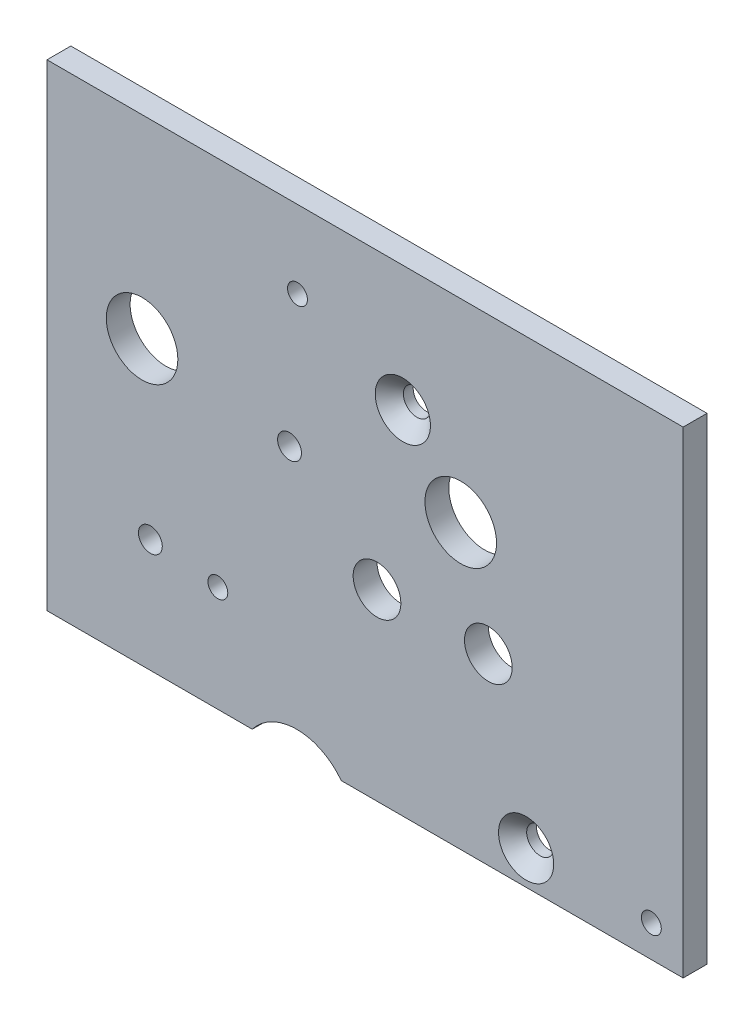
ISO-10303-21;
HEADER;
FILE_DESCRIPTION(('STEP AP214'),'2;1');
FILE_NAME('part.step','',(''),(''),'','','');
FILE_SCHEMA(('AUTOMOTIVE_DESIGN { 1 0 10303 214 1 1 1 1 }'));
ENDSEC;
DATA;
#1=APPLICATION_CONTEXT('core data for automotive mechanical design processes');
#2=APPLICATION_PROTOCOL_DEFINITION('international standard','automotive_design',2000,#1);
#3=PRODUCT_CONTEXT('',#1,'mechanical');
#4=PRODUCT('Part','Part','',(#3));
#5=PRODUCT_RELATED_PRODUCT_CATEGORY('part','',(#4));
#6=PRODUCT_DEFINITION_FORMATION('','',#4);
#7=PRODUCT_DEFINITION_CONTEXT('part definition',#1,'design');
#8=PRODUCT_DEFINITION('design','',#6,#7);
#9=PRODUCT_DEFINITION_SHAPE('','',#8);
#10=(LENGTH_UNIT() NAMED_UNIT(*) SI_UNIT(.MILLI.,.METRE.));
#11=(NAMED_UNIT(*) PLANE_ANGLE_UNIT() SI_UNIT($,.RADIAN.));
#12=(NAMED_UNIT(*) SI_UNIT($,.STERADIAN.) SOLID_ANGLE_UNIT());
#13=UNCERTAINTY_MEASURE_WITH_UNIT(LENGTH_MEASURE(1.E-05),#10,'distance_accuracy_value','');
#14=(GEOMETRIC_REPRESENTATION_CONTEXT(3) GLOBAL_UNCERTAINTY_ASSIGNED_CONTEXT((#13)) GLOBAL_UNIT_ASSIGNED_CONTEXT((#10,
#11,#12)) REPRESENTATION_CONTEXT('',''));
#15=CARTESIAN_POINT('',(0.,0.,0.));
#16=DIRECTION('',(0.,0.,1.));
#17=DIRECTION('',(1.,0.,0.));
#18=AXIS2_PLACEMENT_3D('',#15,#16,#17);
#19=CARTESIAN_POINT('',(-9.69554599829082,222.144430061647,56.1999999999973));
#20=DIRECTION('',(0.,0.,1.));
#21=DIRECTION('',(1.,0.,0.));
#22=AXIS2_PLACEMENT_3D('',#19,#20,#21);
#23=PLANE('',#22);
#24=CARTESIAN_POINT('',(-9.60659272785415,276.603254387935,56.1999999999973));
#25=DIRECTION('',(0.,0.,1.));
#26=DIRECTION('',(1.,0.,0.));
#27=AXIS2_PLACEMENT_3D('',#24,#25,#26);
#28=CIRCLE('',#27,1.25);
#29=CARTESIAN_POINT('',(-8.35659272785415,276.603254387935,56.1999999999973));
#30=VERTEX_POINT('',#29);
#31=EDGE_CURVE('E281',#30,#30,#28,.T.);
#32=ORIENTED_EDGE('',*,*,#31,.F.);
#33=EDGE_LOOP('',(#32));
#34=FACE_BOUND('',#33,.T.);
#35=CARTESIAN_POINT('',(-19.6207435856521,239.653254387935,56.1999999999973));
#36=DIRECTION('',(0.,0.,1.));
#37=DIRECTION('',(1.,0.,0.));
#38=AXIS2_PLACEMENT_3D('',#35,#36,#37);
#39=CIRCLE('',#38,1.25);
#40=CARTESIAN_POINT('',(-18.3707435856521,239.653254387935,56.1999999999973));
#41=VERTEX_POINT('',#40);
#42=EDGE_CURVE('E286',#41,#41,#39,.T.);
#43=ORIENTED_EDGE('',*,*,#42,.F.);
#44=EDGE_LOOP('',(#43));
#45=FACE_BOUND('',#44,.T.);
#46=CARTESIAN_POINT('',(34.8934072721459,230.353254387935,56.1999999999973));
#47=DIRECTION('',(0.,0.,1.));
#48=DIRECTION('',(1.,0.,0.));
#49=AXIS2_PLACEMENT_3D('',#46,#47,#48);
#50=CIRCLE('',#49,1.25);
#51=CARTESIAN_POINT('',(36.1434072721459,230.353254387935,56.1999999999973));
#52=VERTEX_POINT('',#51);
#53=EDGE_CURVE('E290',#52,#52,#50,.T.);
#54=ORIENTED_EDGE('',*,*,#53,.F.);
#55=EDGE_LOOP('',(#54));
#56=FACE_BOUND('',#55,.T.);
#57=CARTESIAN_POINT('',(-28.106592727854,240.603254387935,56.1999999999973));
#58=DIRECTION('',(0.,0.,1.));
#59=DIRECTION('',(1.,0.,0.));
#60=AXIS2_PLACEMENT_3D('',#57,#58,#59);
#61=CIRCLE('',#60,1.5);
#62=CARTESIAN_POINT('',(-26.606592727854,240.603254387935,56.1999999999973));
#63=VERTEX_POINT('',#62);
#64=EDGE_CURVE('E138',#63,#63,#61,.T.);
#65=ORIENTED_EDGE('',*,*,#64,.F.);
#66=EDGE_LOOP('',(#65));
#67=FACE_BOUND('',#66,.T.);
#68=CARTESIAN_POINT('',(-10.606592727854,259.503254387935,56.1999999999973));
#69=DIRECTION('',(0.,0.,1.));
#70=DIRECTION('',(1.,0.,0.));
#71=AXIS2_PLACEMENT_3D('',#68,#69,#70);
#72=CIRCLE('',#71,1.50000000000001);
#73=CARTESIAN_POINT('',(-9.10659272785396,259.503254387935,56.1999999999973));
#74=VERTEX_POINT('',#73);
#75=EDGE_CURVE('E144',#74,#74,#72,.T.);
#76=ORIENTED_EDGE('',*,*,#75,.F.);
#77=EDGE_LOOP('',(#76));
#78=FACE_BOUND('',#77,.T.);
#79=CARTESIAN_POINT('',(3.64340727214603,270.603254387935,56.1999999999973));
#80=DIRECTION('',(0.,0.,1.));
#81=DIRECTION('',(1.,0.,0.));
#82=AXIS2_PLACEMENT_3D('',#79,#80,#81);
#83=CIRCLE('',#82,3.47);
#84=CARTESIAN_POINT('',(7.11340727214603,270.603254387935,56.1999999999973));
#85=VERTEX_POINT('',#84);
#86=EDGE_CURVE('E142',#85,#85,#83,.T.);
#87=ORIENTED_EDGE('',*,*,#86,.F.);
#88=EDGE_LOOP('',(#87));
#89=FACE_BOUND('',#88,.T.);
#90=CARTESIAN_POINT('',(19.143407272146,230.603254387935,56.1999999999973));
#91=DIRECTION('',(0.,0.,1.));
#92=DIRECTION('',(1.,0.,0.));
#93=AXIS2_PLACEMENT_3D('',#90,#91,#92);
#94=CIRCLE('',#93,3.47);
#95=CARTESIAN_POINT('',(22.613407272146,230.603254387935,56.1999999999973));
#96=VERTEX_POINT('',#95);
#97=EDGE_CURVE('E163',#96,#96,#94,.T.);
#98=ORIENTED_EDGE('',*,*,#97,.F.);
#99=EDGE_LOOP('',(#98));
#100=FACE_BOUND('',#99,.T.);
#101=CARTESIAN_POINT('',(-29.1504737784015,261.956143729674,56.1999999999973));
#102=DIRECTION('',(0.,0.,1.));
#103=DIRECTION('',(1.,0.,0.));
#104=AXIS2_PLACEMENT_3D('',#101,#102,#103);
#105=CIRCLE('',#104,4.50000000000001);
#106=CARTESIAN_POINT('',(-24.6504737784015,261.956143729674,56.1999999999973));
#107=VERTEX_POINT('',#106);
#108=EDGE_CURVE('E179',#107,#107,#105,.T.);
#109=ORIENTED_EDGE('',*,*,#108,.F.);
#110=EDGE_LOOP('',(#109));
#111=FACE_BOUND('',#110,.T.);
#112=CARTESIAN_POINT('',(14.393407272146,249.403254387935,56.1999999999973));
#113=DIRECTION('',(0.,0.,1.));
#114=DIRECTION('',(1.,0.,0.));
#115=AXIS2_PLACEMENT_3D('',#112,#113,#114);
#116=CIRCLE('',#115,3.);
#117=CARTESIAN_POINT('',(17.393407272146,249.403254387935,56.1999999999973));
#118=VERTEX_POINT('',#117);
#119=EDGE_CURVE('E124',#118,#118,#116,.T.);
#120=ORIENTED_EDGE('',*,*,#119,.F.);
#121=EDGE_LOOP('',(#120));
#122=FACE_BOUND('',#121,.T.);
#123=DIRECTION('',(0.,-1.,0.));
#124=VECTOR('',#123,1.);
#125=CARTESIAN_POINT('',(-41.106592727854,226.353254387935,56.1999999999973));
#126=LINE('',#125,#124);
#127=CARTESIAN_POINT('',(-41.106592727854,286.353254387935,56.1999999999973));
#128=VERTEX_POINT('',#127);
#129=CARTESIAN_POINT('',(-41.106592727854,226.353254387935,56.1999999999973));
#130=VERTEX_POINT('',#129);
#131=EDGE_CURVE('E131',#128,#130,#126,.T.);
#132=ORIENTED_EDGE('',*,*,#131,.T.);
#133=DIRECTION('',(1.,0.,0.));
#134=VECTOR('',#133,1.);
#135=CARTESIAN_POINT('',(-41.106592727854,226.353254387935,56.1999999999973));
#136=LINE('',#135,#134);
#137=CARTESIAN_POINT('',(-15.2889115804118,226.353254387935,56.1999999999973));
#138=VERTEX_POINT('',#137);
#139=EDGE_CURVE('E89',#130,#138,#136,.T.);
#140=ORIENTED_EDGE('',*,*,#139,.T.);
#141=CARTESIAN_POINT('',(-9.69554599829082,222.144430061647,56.1999999999973));
#142=DIRECTION('',(0.,0.,-1.));
#143=DIRECTION('',(1.,0.,0.));
#144=AXIS2_PLACEMENT_3D('',#141,#142,#143);
#145=CIRCLE('',#144,6.99999576748517);
#146=CARTESIAN_POINT('',(-4.10218041616985,226.353254387935,56.1999999999973));
#147=VERTEX_POINT('',#146);
#148=EDGE_CURVE('E102',#138,#147,#145,.T.);
#149=ORIENTED_EDGE('',*,*,#148,.T.);
#150=DIRECTION('',(1.,0.,0.));
#151=VECTOR('',#150,1.);
#152=CARTESIAN_POINT('',(-4.10218041616985,226.353254387935,56.1999999999973));
#153=LINE('',#152,#151);
#154=CARTESIAN_POINT('',(38.893407272146,226.353254387935,56.1999999999973));
#155=VERTEX_POINT('',#154);
#156=EDGE_CURVE('E96',#147,#155,#153,.T.);
#157=ORIENTED_EDGE('',*,*,#156,.T.);
#158=DIRECTION('',(0.,1.,0.));
#159=VECTOR('',#158,1.);
#160=CARTESIAN_POINT('',(38.893407272146,226.353254387935,56.1999999999973));
#161=LINE('',#160,#159);
#162=CARTESIAN_POINT('',(38.893407272146,286.353254387935,56.1999999999973));
#163=VERTEX_POINT('',#162);
#164=EDGE_CURVE('E100',#155,#163,#161,.T.);
#165=ORIENTED_EDGE('',*,*,#164,.T.);
#166=DIRECTION('',(-1.,0.,0.));
#167=VECTOR('',#166,1.);
#168=CARTESIAN_POINT('',(-41.106592727854,286.353254387935,56.1999999999973));
#169=LINE('',#168,#167);
#170=EDGE_CURVE('E52',#163,#128,#169,.T.);
#171=ORIENTED_EDGE('',*,*,#170,.T.);
#172=EDGE_LOOP('',(#132,#140,#149,#157,#165,#171));
#173=FACE_BOUND('',#172,.T.);
#174=CARTESIAN_POINT('',(0.393407272146032,249.403254387935,56.1999999999973));
#175=DIRECTION('',(0.,0.,1.));
#176=DIRECTION('',(1.,0.,0.));
#177=AXIS2_PLACEMENT_3D('',#174,#175,#176);
#178=CIRCLE('',#177,3.);
#179=CARTESIAN_POINT('',(3.39340727214603,249.403254387935,56.1999999999973));
#180=VERTEX_POINT('',#179);
#181=EDGE_CURVE('E185',#180,#180,#178,.T.);
#182=ORIENTED_EDGE('',*,*,#181,.F.);
#183=EDGE_LOOP('',(#182));
#184=FACE_BOUND('',#183,.T.);
#185=CARTESIAN_POINT('',(10.9230632657301,261.985726174726,56.1999999999973));
#186=DIRECTION('',(0.,0.,1.));
#187=DIRECTION('',(1.,0.,0.));
#188=AXIS2_PLACEMENT_3D('',#185,#186,#187);
#189=CIRCLE('',#188,4.5);
#190=CARTESIAN_POINT('',(15.4230632657301,261.985726174726,56.1999999999973));
#191=VERTEX_POINT('',#190);
#192=EDGE_CURVE('E173',#191,#191,#189,.T.);
#193=ORIENTED_EDGE('',*,*,#192,.F.);
#194=EDGE_LOOP('',(#193));
#195=FACE_BOUND('',#194,.T.);
#196=ADVANCED_FACE('F33',(#34,#45,#56,#67,#78,#89,#100,#111,#122,#173,#184,#195),#23,.T.);
#197=CARTESIAN_POINT('',(-9.69554599829082,222.144430061647,53.1999999999973));
#198=DIRECTION('',(0.,0.,1.));
#199=DIRECTION('',(1.,0.,0.));
#200=AXIS2_PLACEMENT_3D('',#197,#198,#199);
#201=PLANE('',#200);
#202=CARTESIAN_POINT('',(-9.60659272785415,276.603254387935,53.1999999999973));
#203=DIRECTION('',(0.,0.,1.));
#204=DIRECTION('',(1.,0.,0.));
#205=AXIS2_PLACEMENT_3D('',#202,#203,#204);
#206=CIRCLE('',#205,1.25);
#207=CARTESIAN_POINT('',(-8.35659272785415,276.603254387935,53.1999999999973));
#208=VERTEX_POINT('',#207);
#209=EDGE_CURVE('E149',#208,#208,#206,.F.);
#210=ORIENTED_EDGE('',*,*,#209,.F.);
#211=EDGE_LOOP('',(#210));
#212=FACE_BOUND('',#211,.T.);
#213=CARTESIAN_POINT('',(-19.6207435856521,239.653254387935,53.1999999999973));
#214=DIRECTION('',(0.,0.,1.));
#215=DIRECTION('',(1.,0.,0.));
#216=AXIS2_PLACEMENT_3D('',#213,#214,#215);
#217=CIRCLE('',#216,1.25);
#218=CARTESIAN_POINT('',(-18.3707435856521,239.653254387935,53.1999999999973));
#219=VERTEX_POINT('',#218);
#220=EDGE_CURVE('E282',#219,#219,#217,.F.);
#221=ORIENTED_EDGE('',*,*,#220,.F.);
#222=EDGE_LOOP('',(#221));
#223=FACE_BOUND('',#222,.T.);
#224=CARTESIAN_POINT('',(34.8934072721459,230.353254387935,53.1999999999973));
#225=DIRECTION('',(0.,0.,1.));
#226=DIRECTION('',(1.,0.,0.));
#227=AXIS2_PLACEMENT_3D('',#224,#225,#226);
#228=CIRCLE('',#227,1.25);
#229=CARTESIAN_POINT('',(36.1434072721459,230.353254387935,53.1999999999973));
#230=VERTEX_POINT('',#229);
#231=EDGE_CURVE('E152',#230,#230,#228,.F.);
#232=ORIENTED_EDGE('',*,*,#231,.F.);
#233=EDGE_LOOP('',(#232));
#234=FACE_BOUND('',#233,.T.);
#235=CARTESIAN_POINT('',(-28.106592727854,240.603254387935,53.1999999999973));
#236=DIRECTION('',(0.,0.,1.));
#237=DIRECTION('',(1.,0.,0.));
#238=AXIS2_PLACEMENT_3D('',#235,#236,#237);
#239=CIRCLE('',#238,1.5);
#240=CARTESIAN_POINT('',(-26.606592727854,240.603254387935,53.1999999999973));
#241=VERTEX_POINT('',#240);
#242=EDGE_CURVE('E37',#241,#241,#239,.T.);
#243=ORIENTED_EDGE('',*,*,#242,.T.);
#244=EDGE_LOOP('',(#243));
#245=FACE_BOUND('',#244,.T.);
#246=CARTESIAN_POINT('',(-10.606592727854,259.503254387935,53.1999999999973));
#247=DIRECTION('',(0.,0.,1.));
#248=DIRECTION('',(1.,0.,0.));
#249=AXIS2_PLACEMENT_3D('',#246,#247,#248);
#250=CIRCLE('',#249,1.50000000000001);
#251=CARTESIAN_POINT('',(-9.10659272785396,259.503254387935,53.1999999999973));
#252=VERTEX_POINT('',#251);
#253=EDGE_CURVE('E136',#252,#252,#250,.T.);
#254=ORIENTED_EDGE('',*,*,#253,.T.);
#255=EDGE_LOOP('',(#254));
#256=FACE_BOUND('',#255,.T.);
#257=CARTESIAN_POINT('',(3.64340727214603,270.603254387935,53.1999999999972));
#258=DIRECTION('',(0.,0.,1.));
#259=DIRECTION('',(1.,0.,0.));
#260=AXIS2_PLACEMENT_3D('',#257,#258,#259);
#261=CIRCLE('',#260,1.7);
#262=CARTESIAN_POINT('',(5.34340727214603,270.603254387935,53.1999999999972));
#263=VERTEX_POINT('',#262);
#264=EDGE_CURVE('E160',#263,#263,#261,.T.);
#265=ORIENTED_EDGE('',*,*,#264,.T.);
#266=EDGE_LOOP('',(#265));
#267=FACE_BOUND('',#266,.T.);
#268=CARTESIAN_POINT('',(19.143407272146,230.603254387935,53.1999999999973));
#269=DIRECTION('',(0.,0.,1.));
#270=DIRECTION('',(1.,0.,0.));
#271=AXIS2_PLACEMENT_3D('',#268,#269,#270);
#272=CIRCLE('',#271,1.7);
#273=CARTESIAN_POINT('',(20.843407272146,230.603254387935,53.1999999999973));
#274=VERTEX_POINT('',#273);
#275=EDGE_CURVE('E169',#274,#274,#272,.T.);
#276=ORIENTED_EDGE('',*,*,#275,.T.);
#277=EDGE_LOOP('',(#276));
#278=FACE_BOUND('',#277,.T.);
#279=DIRECTION('',(0.,-1.,0.));
#280=VECTOR('',#279,1.);
#281=CARTESIAN_POINT('',(-41.106592727854,226.353254387935,53.1999999999973));
#282=LINE('',#281,#280);
#283=CARTESIAN_POINT('',(-41.106592727854,286.353254387935,53.1999999999973));
#284=VERTEX_POINT('',#283);
#285=CARTESIAN_POINT('',(-41.106592727854,226.353254387935,53.1999999999973));
#286=VERTEX_POINT('',#285);
#287=EDGE_CURVE('E120',#284,#286,#282,.T.);
#288=ORIENTED_EDGE('',*,*,#287,.F.);
#289=DIRECTION('',(-1.,0.,0.));
#290=VECTOR('',#289,1.);
#291=CARTESIAN_POINT('',(-41.106592727854,286.353254387935,53.1999999999973));
#292=LINE('',#291,#290);
#293=CARTESIAN_POINT('',(38.893407272146,286.353254387935,53.1999999999973));
#294=VERTEX_POINT('',#293);
#295=EDGE_CURVE('E81',#294,#284,#292,.T.);
#296=ORIENTED_EDGE('',*,*,#295,.F.);
#297=DIRECTION('',(0.,1.,0.));
#298=VECTOR('',#297,1.);
#299=CARTESIAN_POINT('',(38.893407272146,226.353254387935,53.1999999999973));
#300=LINE('',#299,#298);
#301=CARTESIAN_POINT('',(38.893407272146,226.353254387935,53.1999999999973));
#302=VERTEX_POINT('',#301);
#303=EDGE_CURVE('E75',#302,#294,#300,.T.);
#304=ORIENTED_EDGE('',*,*,#303,.F.);
#305=DIRECTION('',(1.,0.,0.));
#306=VECTOR('',#305,1.);
#307=CARTESIAN_POINT('',(-4.10218041616985,226.353254387935,53.1999999999973));
#308=LINE('',#307,#306);
#309=CARTESIAN_POINT('',(-4.10218041616985,226.353254387935,53.1999999999973));
#310=VERTEX_POINT('',#309);
#311=EDGE_CURVE('E110',#310,#302,#308,.T.);
#312=ORIENTED_EDGE('',*,*,#311,.F.);
#313=CARTESIAN_POINT('',(-9.69554599829082,222.144430061647,53.1999999999973));
#314=DIRECTION('',(0.,0.,-1.));
#315=DIRECTION('',(1.,0.,0.));
#316=AXIS2_PLACEMENT_3D('',#313,#314,#315);
#317=CIRCLE('',#316,6.99999576748517);
#318=CARTESIAN_POINT('',(-15.2889115804118,226.353254387935,53.1999999999973));
#319=VERTEX_POINT('',#318);
#320=EDGE_CURVE('E126',#319,#310,#317,.T.);
#321=ORIENTED_EDGE('',*,*,#320,.F.);
#322=DIRECTION('',(1.,0.,0.));
#323=VECTOR('',#322,1.);
#324=CARTESIAN_POINT('',(-41.106592727854,226.353254387935,53.1999999999973));
#325=LINE('',#324,#323);
#326=EDGE_CURVE('E123',#286,#319,#325,.T.);
#327=ORIENTED_EDGE('',*,*,#326,.F.);
#328=EDGE_LOOP('',(#288,#296,#304,#312,#321,#327));
#329=FACE_BOUND('',#328,.T.);
#330=CARTESIAN_POINT('',(14.393407272146,249.403254387935,53.1999999999973));
#331=DIRECTION('',(0.,0.,1.));
#332=DIRECTION('',(1.,0.,0.));
#333=AXIS2_PLACEMENT_3D('',#330,#331,#332);
#334=CIRCLE('',#333,3.);
#335=CARTESIAN_POINT('',(17.393407272146,249.403254387935,53.1999999999973));
#336=VERTEX_POINT('',#335);
#337=EDGE_CURVE('E188',#336,#336,#334,.T.);
#338=ORIENTED_EDGE('',*,*,#337,.T.);
#339=EDGE_LOOP('',(#338));
#340=FACE_BOUND('',#339,.T.);
#341=CARTESIAN_POINT('',(0.393407272146032,249.403254387935,53.1999999999973));
#342=DIRECTION('',(0.,0.,1.));
#343=DIRECTION('',(1.,0.,0.));
#344=AXIS2_PLACEMENT_3D('',#341,#342,#343);
#345=CIRCLE('',#344,3.);
#346=CARTESIAN_POINT('',(3.39340727214603,249.403254387935,53.1999999999973));
#347=VERTEX_POINT('',#346);
#348=EDGE_CURVE('E182',#347,#347,#345,.T.);
#349=ORIENTED_EDGE('',*,*,#348,.T.);
#350=EDGE_LOOP('',(#349));
#351=FACE_BOUND('',#350,.T.);
#352=CARTESIAN_POINT('',(-29.1504737784015,261.956143729674,53.1999999999973));
#353=DIRECTION('',(0.,0.,1.));
#354=DIRECTION('',(1.,0.,0.));
#355=AXIS2_PLACEMENT_3D('',#352,#353,#354);
#356=CIRCLE('',#355,4.50000000000001);
#357=CARTESIAN_POINT('',(-24.6504737784015,261.956143729674,53.1999999999973));
#358=VERTEX_POINT('',#357);
#359=EDGE_CURVE('E176',#358,#358,#356,.T.);
#360=ORIENTED_EDGE('',*,*,#359,.T.);
#361=EDGE_LOOP('',(#360));
#362=FACE_BOUND('',#361,.T.);
#363=CARTESIAN_POINT('',(10.9230632657301,261.985726174726,53.1999999999973));
#364=DIRECTION('',(0.,0.,1.));
#365=DIRECTION('',(1.,0.,0.));
#366=AXIS2_PLACEMENT_3D('',#363,#364,#365);
#367=CIRCLE('',#366,4.5);
#368=CARTESIAN_POINT('',(15.4230632657301,261.985726174726,53.1999999999973));
#369=VERTEX_POINT('',#368);
#370=EDGE_CURVE('E172',#369,#369,#367,.T.);
#371=ORIENTED_EDGE('',*,*,#370,.T.);
#372=EDGE_LOOP('',(#371));
#373=FACE_BOUND('',#372,.T.);
#374=ADVANCED_FACE('F204',(#212,#223,#234,#245,#256,#267,#278,#329,#340,#351,#362,#373),#201,.F.);
#375=CARTESIAN_POINT('',(-41.106592727854,226.353254387935,56.1999999999973));
#376=DIRECTION('',(1.,0.,0.));
#377=DIRECTION('',(0.,0.,-1.));
#378=AXIS2_PLACEMENT_3D('',#375,#376,#377);
#379=PLANE('',#378);
#380=ORIENTED_EDGE('',*,*,#287,.T.);
#381=DIRECTION('',(0.,0.,-1.));
#382=VECTOR('',#381,1.);
#383=CARTESIAN_POINT('',(-41.106592727854,226.353254387935,56.1999999999973));
#384=LINE('',#383,#382);
#385=EDGE_CURVE('E11',#130,#286,#384,.T.);
#386=ORIENTED_EDGE('',*,*,#385,.F.);
#387=ORIENTED_EDGE('',*,*,#131,.F.);
#388=DIRECTION('',(0.,0.,-1.));
#389=VECTOR('',#388,1.);
#390=CARTESIAN_POINT('',(-41.106592727854,286.353254387935,56.1999999999973));
#391=LINE('',#390,#389);
#392=EDGE_CURVE('E116',#128,#284,#391,.T.);
#393=ORIENTED_EDGE('',*,*,#392,.T.);
#394=EDGE_LOOP('',(#380,#386,#387,#393));
#395=FACE_BOUND('',#394,.T.);
#396=ADVANCED_FACE('F35',(#395),#379,.F.);
#397=CARTESIAN_POINT('',(-41.106592727854,226.353254387935,56.1999999999973));
#398=DIRECTION('',(0.,1.,0.));
#399=DIRECTION('',(0.,0.,1.));
#400=AXIS2_PLACEMENT_3D('',#397,#398,#399);
#401=PLANE('',#400);
#402=ORIENTED_EDGE('',*,*,#326,.T.);
#403=DIRECTION('',(0.,0.,-1.));
#404=VECTOR('',#403,1.);
#405=CARTESIAN_POINT('',(-15.2889115804118,226.353254387935,56.1999999999973));
#406=LINE('',#405,#404);
#407=EDGE_CURVE('E43',#138,#319,#406,.T.);
#408=ORIENTED_EDGE('',*,*,#407,.F.);
#409=ORIENTED_EDGE('',*,*,#139,.F.);
#410=ORIENTED_EDGE('',*,*,#385,.T.);
#411=EDGE_LOOP('',(#402,#408,#409,#410));
#412=FACE_BOUND('',#411,.T.);
#413=ADVANCED_FACE('F198',(#412),#401,.F.);
#414=CARTESIAN_POINT('',(-9.69554599829082,222.144430061647,56.1999999999973));
#415=DIRECTION('',(0.,0.,-1.));
#416=DIRECTION('',(-1.,0.,0.));
#417=AXIS2_PLACEMENT_3D('',#414,#415,#416);
#418=CYLINDRICAL_SURFACE('',#417,6.99999576748517);
#419=ORIENTED_EDGE('',*,*,#320,.T.);
#420=DIRECTION('',(0.,0.,-1.));
#421=VECTOR('',#420,1.);
#422=CARTESIAN_POINT('',(-4.10218041616985,226.353254387935,56.1999999999973));
#423=LINE('',#422,#421);
#424=EDGE_CURVE('E111',#147,#310,#423,.T.);
#425=ORIENTED_EDGE('',*,*,#424,.F.);
#426=ORIENTED_EDGE('',*,*,#148,.F.);
#427=ORIENTED_EDGE('',*,*,#407,.T.);
#428=EDGE_LOOP('',(#419,#425,#426,#427));
#429=FACE_BOUND('',#428,.T.);
#430=ADVANCED_FACE('F201',(#429),#418,.F.);
#431=CARTESIAN_POINT('',(-4.10218041616985,226.353254387935,56.1999999999973));
#432=DIRECTION('',(0.,1.,0.));
#433=DIRECTION('',(0.,0.,1.));
#434=AXIS2_PLACEMENT_3D('',#431,#432,#433);
#435=PLANE('',#434);
#436=ORIENTED_EDGE('',*,*,#311,.T.);
#437=DIRECTION('',(0.,0.,-1.));
#438=VECTOR('',#437,1.);
#439=CARTESIAN_POINT('',(38.893407272146,226.353254387935,56.1999999999973));
#440=LINE('',#439,#438);
#441=EDGE_CURVE('E107',#155,#302,#440,.T.);
#442=ORIENTED_EDGE('',*,*,#441,.F.);
#443=ORIENTED_EDGE('',*,*,#156,.F.);
#444=ORIENTED_EDGE('',*,*,#424,.T.);
#445=EDGE_LOOP('',(#436,#442,#443,#444));
#446=FACE_BOUND('',#445,.T.);
#447=ADVANCED_FACE('F108',(#446),#435,.F.);
#448=CARTESIAN_POINT('',(38.893407272146,226.353254387935,56.1999999999973));
#449=DIRECTION('',(-1.,0.,0.));
#450=DIRECTION('',(0.,0.,1.));
#451=AXIS2_PLACEMENT_3D('',#448,#449,#450);
#452=PLANE('',#451);
#453=ORIENTED_EDGE('',*,*,#303,.T.);
#454=DIRECTION('',(0.,0.,-1.));
#455=VECTOR('',#454,1.);
#456=CARTESIAN_POINT('',(38.893407272146,286.353254387935,56.1999999999973));
#457=LINE('',#456,#455);
#458=EDGE_CURVE('E112',#163,#294,#457,.T.);
#459=ORIENTED_EDGE('',*,*,#458,.F.);
#460=ORIENTED_EDGE('',*,*,#164,.F.);
#461=ORIENTED_EDGE('',*,*,#441,.T.);
#462=EDGE_LOOP('',(#453,#459,#460,#461));
#463=FACE_BOUND('',#462,.T.);
#464=ADVANCED_FACE('F114',(#463),#452,.F.);
#465=CARTESIAN_POINT('',(-41.106592727854,286.353254387935,56.1999999999973));
#466=DIRECTION('',(0.,-1.,0.));
#467=DIRECTION('',(0.,0.,-1.));
#468=AXIS2_PLACEMENT_3D('',#465,#466,#467);
#469=PLANE('',#468);
#470=ORIENTED_EDGE('',*,*,#295,.T.);
#471=ORIENTED_EDGE('',*,*,#392,.F.);
#472=ORIENTED_EDGE('',*,*,#170,.F.);
#473=ORIENTED_EDGE('',*,*,#458,.T.);
#474=EDGE_LOOP('',(#470,#471,#472,#473));
#475=FACE_BOUND('',#474,.T.);
#476=ADVANCED_FACE('F207',(#475),#469,.F.);
#477=CARTESIAN_POINT('',(14.393407272146,249.403254387935,56.1999999999973));
#478=DIRECTION('',(0.,0.,-1.));
#479=DIRECTION('',(-1.,0.,0.));
#480=AXIS2_PLACEMENT_3D('',#477,#478,#479);
#481=CYLINDRICAL_SURFACE('',#480,3.);
#482=ORIENTED_EDGE('',*,*,#119,.T.);
#483=EDGE_LOOP('',(#482));
#484=FACE_BOUND('',#483,.T.);
#485=ORIENTED_EDGE('',*,*,#337,.F.);
#486=EDGE_LOOP('',(#485));
#487=FACE_BOUND('',#486,.T.);
#488=ADVANCED_FACE('F209',(#484,#487),#481,.F.);
#489=CARTESIAN_POINT('',(0.393407272146032,249.403254387935,56.1999999999973));
#490=DIRECTION('',(0.,0.,-1.));
#491=DIRECTION('',(-1.,0.,0.));
#492=AXIS2_PLACEMENT_3D('',#489,#490,#491);
#493=CYLINDRICAL_SURFACE('',#492,3.);
#494=ORIENTED_EDGE('',*,*,#181,.T.);
#495=EDGE_LOOP('',(#494));
#496=FACE_BOUND('',#495,.T.);
#497=ORIENTED_EDGE('',*,*,#348,.F.);
#498=EDGE_LOOP('',(#497));
#499=FACE_BOUND('',#498,.T.);
#500=ADVANCED_FACE('F215',(#496,#499),#493,.F.);
#501=CARTESIAN_POINT('',(-29.1504737784015,261.956143729674,56.1999999999973));
#502=DIRECTION('',(0.,0.,-1.));
#503=DIRECTION('',(-1.,0.,0.));
#504=AXIS2_PLACEMENT_3D('',#501,#502,#503);
#505=CYLINDRICAL_SURFACE('',#504,4.50000000000001);
#506=ORIENTED_EDGE('',*,*,#108,.T.);
#507=EDGE_LOOP('',(#506));
#508=FACE_BOUND('',#507,.T.);
#509=ORIENTED_EDGE('',*,*,#359,.F.);
#510=EDGE_LOOP('',(#509));
#511=FACE_BOUND('',#510,.T.);
#512=ADVANCED_FACE('F232',(#508,#511),#505,.F.);
#513=CARTESIAN_POINT('',(10.9230632657301,261.985726174726,56.1999999999973));
#514=DIRECTION('',(0.,0.,-1.));
#515=DIRECTION('',(-1.,0.,0.));
#516=AXIS2_PLACEMENT_3D('',#513,#514,#515);
#517=CYLINDRICAL_SURFACE('',#516,4.5);
#518=ORIENTED_EDGE('',*,*,#192,.T.);
#519=EDGE_LOOP('',(#518));
#520=FACE_BOUND('',#519,.T.);
#521=ORIENTED_EDGE('',*,*,#370,.F.);
#522=EDGE_LOOP('',(#521));
#523=FACE_BOUND('',#522,.T.);
#524=ADVANCED_FACE('F236',(#520,#523),#517,.F.);
#525=CARTESIAN_POINT('',(19.143407272146,230.603254387935,56.1999999999973));
#526=DIRECTION('',(0.,0.,1.));
#527=DIRECTION('',(1.,0.,0.));
#528=AXIS2_PLACEMENT_3D('',#525,#526,#527);
#529=CYLINDRICAL_SURFACE('',#528,1.7);
#530=ORIENTED_EDGE('',*,*,#275,.F.);
#531=EDGE_LOOP('',(#530));
#532=FACE_BOUND('',#531,.T.);
#533=CARTESIAN_POINT('',(19.143407272146,230.603254387935,54.4299999999973));
#534=DIRECTION('',(0.,0.,1.));
#535=DIRECTION('',(1.,0.,0.));
#536=AXIS2_PLACEMENT_3D('',#533,#534,#535);
#537=CIRCLE('',#536,1.7);
#538=CARTESIAN_POINT('',(20.843407272146,230.603254387935,54.4299999999973));
#539=VERTEX_POINT('',#538);
#540=EDGE_CURVE('E166',#539,#539,#537,.T.);
#541=ORIENTED_EDGE('',*,*,#540,.T.);
#542=EDGE_LOOP('',(#541));
#543=FACE_BOUND('',#542,.T.);
#544=ADVANCED_FACE('F240',(#532,#543),#529,.F.);
#545=CARTESIAN_POINT('',(19.143407272146,230.603254387935,56.1999999999973));
#546=DIRECTION('',(0.,0.,1.));
#547=DIRECTION('',(1.,0.,0.));
#548=AXIS2_PLACEMENT_3D('',#545,#546,#547);
#549=CONICAL_SURFACE('',#548,3.47,0.785398163397448);
#550=ORIENTED_EDGE('',*,*,#540,.F.);
#551=EDGE_LOOP('',(#550));
#552=FACE_BOUND('',#551,.T.);
#553=ORIENTED_EDGE('',*,*,#97,.T.);
#554=EDGE_LOOP('',(#553));
#555=FACE_BOUND('',#554,.T.);
#556=ADVANCED_FACE('F244',(#552,#555),#549,.F.);
#557=CARTESIAN_POINT('',(3.64340727214603,270.603254387935,56.1999999999973));
#558=DIRECTION('',(0.,0.,1.));
#559=DIRECTION('',(1.,0.,0.));
#560=AXIS2_PLACEMENT_3D('',#557,#558,#559);
#561=CYLINDRICAL_SURFACE('',#560,1.7);
#562=ORIENTED_EDGE('',*,*,#264,.F.);
#563=EDGE_LOOP('',(#562));
#564=FACE_BOUND('',#563,.T.);
#565=CARTESIAN_POINT('',(3.64340727214603,270.603254387935,54.4299999999972));
#566=DIRECTION('',(0.,0.,1.));
#567=DIRECTION('',(1.,0.,0.));
#568=AXIS2_PLACEMENT_3D('',#565,#566,#567);
#569=CIRCLE('',#568,1.7);
#570=CARTESIAN_POINT('',(5.34340727214603,270.603254387935,54.4299999999972));
#571=VERTEX_POINT('',#570);
#572=EDGE_CURVE('E157',#571,#571,#569,.T.);
#573=ORIENTED_EDGE('',*,*,#572,.T.);
#574=EDGE_LOOP('',(#573));
#575=FACE_BOUND('',#574,.T.);
#576=ADVANCED_FACE('F248',(#564,#575),#561,.F.);
#577=CARTESIAN_POINT('',(3.64340727214603,270.603254387935,56.1999999999973));
#578=DIRECTION('',(0.,0.,1.));
#579=DIRECTION('',(1.,0.,0.));
#580=AXIS2_PLACEMENT_3D('',#577,#578,#579);
#581=CONICAL_SURFACE('',#580,3.47,0.785398163397448);
#582=ORIENTED_EDGE('',*,*,#572,.F.);
#583=EDGE_LOOP('',(#582));
#584=FACE_BOUND('',#583,.T.);
#585=ORIENTED_EDGE('',*,*,#86,.T.);
#586=EDGE_LOOP('',(#585));
#587=FACE_BOUND('',#586,.T.);
#588=ADVANCED_FACE('F252',(#584,#587),#581,.F.);
#589=CARTESIAN_POINT('',(-10.606592727854,259.503254387935,46.1999999999973));
#590=DIRECTION('',(0.,0.,1.));
#591=DIRECTION('',(1.,0.,0.));
#592=AXIS2_PLACEMENT_3D('',#589,#590,#591);
#593=CYLINDRICAL_SURFACE('',#592,1.50000000000001);
#594=ORIENTED_EDGE('',*,*,#75,.T.);
#595=EDGE_LOOP('',(#594));
#596=FACE_BOUND('',#595,.T.);
#597=ORIENTED_EDGE('',*,*,#253,.F.);
#598=EDGE_LOOP('',(#597));
#599=FACE_BOUND('',#598,.T.);
#600=ADVANCED_FACE('F256',(#596,#599),#593,.F.);
#601=CARTESIAN_POINT('',(-28.106592727854,240.603254387935,46.1999999999973));
#602=DIRECTION('',(0.,0.,1.));
#603=DIRECTION('',(1.,0.,0.));
#604=AXIS2_PLACEMENT_3D('',#601,#602,#603);
#605=CYLINDRICAL_SURFACE('',#604,1.5);
#606=ORIENTED_EDGE('',*,*,#64,.T.);
#607=EDGE_LOOP('',(#606));
#608=FACE_BOUND('',#607,.T.);
#609=ORIENTED_EDGE('',*,*,#242,.F.);
#610=EDGE_LOOP('',(#609));
#611=FACE_BOUND('',#610,.T.);
#612=ADVANCED_FACE('F260',(#608,#611),#605,.F.);
#613=CARTESIAN_POINT('',(34.8934072721459,230.353254387935,49.6644660940645));
#614=DIRECTION('',(0.,0.,1.));
#615=DIRECTION('',(1.,0.,0.));
#616=AXIS2_PLACEMENT_3D('',#613,#614,#615);
#617=CYLINDRICAL_SURFACE('',#616,1.25);
#618=ORIENTED_EDGE('',*,*,#231,.T.);
#619=EDGE_LOOP('',(#618));
#620=FACE_BOUND('',#619,.T.);
#621=ORIENTED_EDGE('',*,*,#53,.T.);
#622=EDGE_LOOP('',(#621));
#623=FACE_BOUND('',#622,.T.);
#624=ADVANCED_FACE('F264',(#620,#623),#617,.F.);
#625=CARTESIAN_POINT('',(-19.6207435856521,239.653254387935,49.6644660940645));
#626=DIRECTION('',(0.,0.,1.));
#627=DIRECTION('',(1.,0.,0.));
#628=AXIS2_PLACEMENT_3D('',#625,#626,#627);
#629=CYLINDRICAL_SURFACE('',#628,1.25);
#630=ORIENTED_EDGE('',*,*,#220,.T.);
#631=EDGE_LOOP('',(#630));
#632=FACE_BOUND('',#631,.T.);
#633=ORIENTED_EDGE('',*,*,#42,.T.);
#634=EDGE_LOOP('',(#633));
#635=FACE_BOUND('',#634,.T.);
#636=ADVANCED_FACE('F267',(#632,#635),#629,.F.);
#637=CARTESIAN_POINT('',(-9.60659272785415,276.603254387935,49.6644660940645));
#638=DIRECTION('',(0.,0.,1.));
#639=DIRECTION('',(1.,0.,0.));
#640=AXIS2_PLACEMENT_3D('',#637,#638,#639);
#641=CYLINDRICAL_SURFACE('',#640,1.25);
#642=ORIENTED_EDGE('',*,*,#209,.T.);
#643=EDGE_LOOP('',(#642));
#644=FACE_BOUND('',#643,.T.);
#645=ORIENTED_EDGE('',*,*,#31,.T.);
#646=EDGE_LOOP('',(#645));
#647=FACE_BOUND('',#646,.T.);
#648=ADVANCED_FACE('F271',(#644,#647),#641,.F.);
#649=CLOSED_SHELL('',(#196,#374,#396,#413,#430,#447,#464,#476,#488,#500,#512,#524,#544,#556,
#576,#588,#600,#612,#624,#636,#648));
#650=MANIFOLD_SOLID_BREP('B2',#649);
#651=ADVANCED_BREP_SHAPE_REPRESENTATION('',(#18,#650),#14);
#652=SHAPE_DEFINITION_REPRESENTATION(#9,#651);
ENDSEC;
END-ISO-10303-21;
